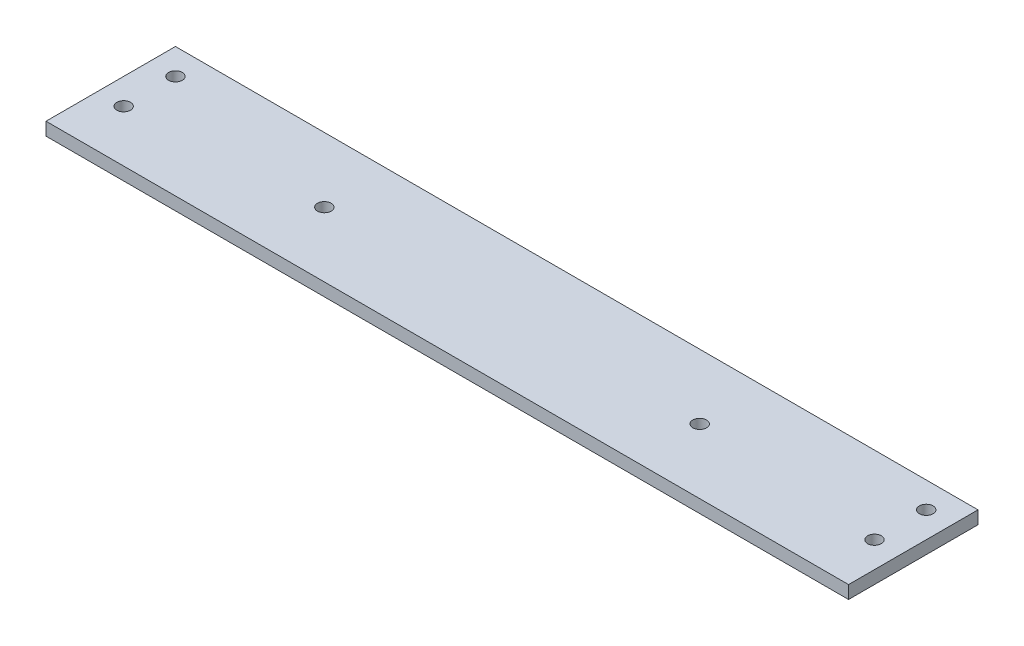
ISO-10303-21;
HEADER;
FILE_DESCRIPTION(('STEP AP214'),'2;1');
FILE_NAME('part.step','',(''),(''),'','','');
FILE_SCHEMA(('AUTOMOTIVE_DESIGN { 1 0 10303 214 1 1 1 1 }'));
ENDSEC;
DATA;
#1=APPLICATION_CONTEXT('core data for automotive mechanical design processes');
#2=APPLICATION_PROTOCOL_DEFINITION('international standard','automotive_design',2000,#1);
#3=PRODUCT_CONTEXT('',#1,'mechanical');
#4=PRODUCT('Part','Part','',(#3));
#5=PRODUCT_RELATED_PRODUCT_CATEGORY('part','',(#4));
#6=PRODUCT_DEFINITION_FORMATION('','',#4);
#7=PRODUCT_DEFINITION_CONTEXT('part definition',#1,'design');
#8=PRODUCT_DEFINITION('design','',#6,#7);
#9=PRODUCT_DEFINITION_SHAPE('','',#8);
#10=(LENGTH_UNIT() NAMED_UNIT(*) SI_UNIT(.MILLI.,.METRE.));
#11=(NAMED_UNIT(*) PLANE_ANGLE_UNIT() SI_UNIT($,.RADIAN.));
#12=(NAMED_UNIT(*) SI_UNIT($,.STERADIAN.) SOLID_ANGLE_UNIT());
#13=UNCERTAINTY_MEASURE_WITH_UNIT(LENGTH_MEASURE(1.E-05),#10,'distance_accuracy_value','');
#14=(GEOMETRIC_REPRESENTATION_CONTEXT(3) GLOBAL_UNCERTAINTY_ASSIGNED_CONTEXT((#13)) GLOBAL_UNIT_ASSIGNED_CONTEXT((#10,
#11,#12)) REPRESENTATION_CONTEXT('',''));
#15=CARTESIAN_POINT('',(0.,0.,0.));
#16=DIRECTION('',(0.,0.,1.));
#17=DIRECTION('',(1.,0.,0.));
#18=AXIS2_PLACEMENT_3D('',#15,#16,#17);
#19=CARTESIAN_POINT('',(196.85,6.35,31.75));
#20=DIRECTION('',(-1.,0.,0.));
#21=DIRECTION('',(0.,0.,1.));
#22=AXIS2_PLACEMENT_3D('',#19,#20,#21);
#23=PLANE('',#22);
#24=DIRECTION('',(0.,0.,-1.));
#25=VECTOR('',#24,1.);
#26=CARTESIAN_POINT('',(196.85,0.,31.75));
#27=LINE('',#26,#25);
#28=CARTESIAN_POINT('',(196.85,0.,31.75));
#29=VERTEX_POINT('',#28);
#30=CARTESIAN_POINT('',(196.85,0.,-31.75));
#31=VERTEX_POINT('',#30);
#32=EDGE_CURVE('E120',#29,#31,#27,.T.);
#33=ORIENTED_EDGE('',*,*,#32,.T.);
#34=DIRECTION('',(0.,-1.,0.));
#35=VECTOR('',#34,1.);
#36=CARTESIAN_POINT('',(196.85,6.35,-31.75));
#37=LINE('',#36,#35);
#38=CARTESIAN_POINT('',(196.85,6.35,-31.75));
#39=VERTEX_POINT('',#38);
#40=EDGE_CURVE('E11',#39,#31,#37,.T.);
#41=ORIENTED_EDGE('',*,*,#40,.F.);
#42=DIRECTION('',(0.,0.,-1.));
#43=VECTOR('',#42,1.);
#44=CARTESIAN_POINT('',(196.85,6.35,31.75));
#45=LINE('',#44,#43);
#46=CARTESIAN_POINT('',(196.85,6.35,31.75));
#47=VERTEX_POINT('',#46);
#48=EDGE_CURVE('E103',#47,#39,#45,.T.);
#49=ORIENTED_EDGE('',*,*,#48,.F.);
#50=DIRECTION('',(0.,-1.,0.));
#51=VECTOR('',#50,1.);
#52=CARTESIAN_POINT('',(196.85,6.35,31.75));
#53=LINE('',#52,#51);
#54=EDGE_CURVE('E116',#47,#29,#53,.T.);
#55=ORIENTED_EDGE('',*,*,#54,.T.);
#56=EDGE_LOOP('',(#33,#41,#49,#55));
#57=FACE_BOUND('',#56,.T.);
#58=ADVANCED_FACE('F51',(#57),#23,.F.);
#59=CARTESIAN_POINT('',(-196.85,6.35,-31.75));
#60=DIRECTION('',(0.,0.,1.));
#61=DIRECTION('',(1.,0.,0.));
#62=AXIS2_PLACEMENT_3D('',#59,#60,#61);
#63=PLANE('',#62);
#64=DIRECTION('',(-1.,0.,0.));
#65=VECTOR('',#64,1.);
#66=CARTESIAN_POINT('',(-196.85,0.,-31.75));
#67=LINE('',#66,#65);
#68=CARTESIAN_POINT('',(-196.85,0.,-31.75));
#69=VERTEX_POINT('',#68);
#70=EDGE_CURVE('E108',#31,#69,#67,.T.);
#71=ORIENTED_EDGE('',*,*,#70,.T.);
#72=DIRECTION('',(0.,-1.,0.));
#73=VECTOR('',#72,1.);
#74=CARTESIAN_POINT('',(-196.85,6.35,-31.75));
#75=LINE('',#74,#73);
#76=CARTESIAN_POINT('',(-196.85,6.35,-31.75));
#77=VERTEX_POINT('',#76);
#78=EDGE_CURVE('E60',#77,#69,#75,.T.);
#79=ORIENTED_EDGE('',*,*,#78,.F.);
#80=DIRECTION('',(-1.,0.,0.));
#81=VECTOR('',#80,1.);
#82=CARTESIAN_POINT('',(-196.85,6.35,-31.75));
#83=LINE('',#82,#81);
#84=EDGE_CURVE('E98',#39,#77,#83,.T.);
#85=ORIENTED_EDGE('',*,*,#84,.F.);
#86=ORIENTED_EDGE('',*,*,#40,.T.);
#87=EDGE_LOOP('',(#71,#79,#85,#86));
#88=FACE_BOUND('',#87,.T.);
#89=ADVANCED_FACE('F107',(#88),#63,.F.);
#90=CARTESIAN_POINT('',(-196.85,6.35,31.75));
#91=DIRECTION('',(1.,0.,0.));
#92=DIRECTION('',(0.,0.,-1.));
#93=AXIS2_PLACEMENT_3D('',#90,#91,#92);
#94=PLANE('',#93);
#95=DIRECTION('',(0.,0.,1.));
#96=VECTOR('',#95,1.);
#97=CARTESIAN_POINT('',(-196.85,0.,31.75));
#98=LINE('',#97,#96);
#99=CARTESIAN_POINT('',(-196.85,0.,31.75));
#100=VERTEX_POINT('',#99);
#101=EDGE_CURVE('E85',#69,#100,#98,.T.);
#102=ORIENTED_EDGE('',*,*,#101,.T.);
#103=DIRECTION('',(0.,-1.,0.));
#104=VECTOR('',#103,1.);
#105=CARTESIAN_POINT('',(-196.85,6.35,31.75));
#106=LINE('',#105,#104);
#107=CARTESIAN_POINT('',(-196.85,6.35,31.75));
#108=VERTEX_POINT('',#107);
#109=EDGE_CURVE('E110',#108,#100,#106,.T.);
#110=ORIENTED_EDGE('',*,*,#109,.F.);
#111=DIRECTION('',(0.,0.,1.));
#112=VECTOR('',#111,1.);
#113=CARTESIAN_POINT('',(-196.85,6.35,31.75));
#114=LINE('',#113,#112);
#115=EDGE_CURVE('E101',#77,#108,#114,.T.);
#116=ORIENTED_EDGE('',*,*,#115,.F.);
#117=ORIENTED_EDGE('',*,*,#78,.T.);
#118=EDGE_LOOP('',(#102,#110,#116,#117));
#119=FACE_BOUND('',#118,.T.);
#120=ADVANCED_FACE('F111',(#119),#94,.F.);
#121=CARTESIAN_POINT('',(-196.85,6.35,31.75));
#122=DIRECTION('',(0.,0.,-1.));
#123=DIRECTION('',(-1.,0.,0.));
#124=AXIS2_PLACEMENT_3D('',#121,#122,#123);
#125=PLANE('',#124);
#126=DIRECTION('',(1.,0.,0.));
#127=VECTOR('',#126,1.);
#128=CARTESIAN_POINT('',(-196.85,0.,31.75));
#129=LINE('',#128,#127);
#130=EDGE_CURVE('E91',#100,#29,#129,.T.);
#131=ORIENTED_EDGE('',*,*,#130,.T.);
#132=ORIENTED_EDGE('',*,*,#54,.F.);
#133=DIRECTION('',(1.,0.,0.));
#134=VECTOR('',#133,1.);
#135=CARTESIAN_POINT('',(-196.85,6.35,31.75));
#136=LINE('',#135,#134);
#137=EDGE_CURVE('E68',#108,#47,#136,.T.);
#138=ORIENTED_EDGE('',*,*,#137,.F.);
#139=ORIENTED_EDGE('',*,*,#109,.T.);
#140=EDGE_LOOP('',(#131,#132,#138,#139));
#141=FACE_BOUND('',#140,.T.);
#142=ADVANCED_FACE('F135',(#141),#125,.F.);
#143=CARTESIAN_POINT('',(0.,6.35,0.));
#144=DIRECTION('',(0.,-1.,0.));
#145=DIRECTION('',(0.,0.,-1.));
#146=AXIS2_PLACEMENT_3D('',#143,#144,#145);
#147=PLANE('',#146);
#148=CARTESIAN_POINT('',(-184.15,6.35,6.35));
#149=DIRECTION('',(0.,-1.,0.));
#150=DIRECTION('',(0.,0.,-1.));
#151=AXIS2_PLACEMENT_3D('',#148,#149,#150);
#152=CIRCLE('',#151,3.36549999999999);
#153=CARTESIAN_POINT('',(-184.15,6.35,2.98450000000001));
#154=VERTEX_POINT('',#153);
#155=EDGE_CURVE('E147',#154,#154,#152,.T.);
#156=ORIENTED_EDGE('',*,*,#155,.T.);
#157=EDGE_LOOP('',(#156));
#158=FACE_BOUND('',#157,.T.);
#159=CARTESIAN_POINT('',(-184.15,6.35,-19.05));
#160=DIRECTION('',(0.,-1.,0.));
#161=DIRECTION('',(0.,0.,-1.));
#162=AXIS2_PLACEMENT_3D('',#159,#160,#161);
#163=CIRCLE('',#162,3.36549999999999);
#164=CARTESIAN_POINT('',(-184.15,6.35,-22.4155));
#165=VERTEX_POINT('',#164);
#166=EDGE_CURVE('E172',#165,#165,#163,.T.);
#167=ORIENTED_EDGE('',*,*,#166,.T.);
#168=EDGE_LOOP('',(#167));
#169=FACE_BOUND('',#168,.T.);
#170=CARTESIAN_POINT('',(92.0750000000001,6.35,1.11022302462516E-13));
#171=DIRECTION('',(0.,-1.,0.));
#172=DIRECTION('',(0.,0.,-1.));
#173=AXIS2_PLACEMENT_3D('',#170,#171,#172);
#174=CIRCLE('',#173,3.36549999999999);
#175=CARTESIAN_POINT('',(92.0750000000001,6.35,-3.36549999999988));
#176=VERTEX_POINT('',#175);
#177=EDGE_CURVE('E164',#176,#176,#174,.T.);
#178=ORIENTED_EDGE('',*,*,#177,.T.);
#179=EDGE_LOOP('',(#178));
#180=FACE_BOUND('',#179,.T.);
#181=CARTESIAN_POINT('',(184.15,6.35,6.35));
#182=DIRECTION('',(0.,-1.,0.));
#183=DIRECTION('',(0.,0.,-1.));
#184=AXIS2_PLACEMENT_3D('',#181,#182,#183);
#185=CIRCLE('',#184,3.36549999999999);
#186=CARTESIAN_POINT('',(184.15,6.35,2.98450000000001));
#187=VERTEX_POINT('',#186);
#188=EDGE_CURVE('E155',#187,#187,#185,.T.);
#189=ORIENTED_EDGE('',*,*,#188,.T.);
#190=EDGE_LOOP('',(#189));
#191=FACE_BOUND('',#190,.T.);
#192=CARTESIAN_POINT('',(184.15,6.35,-19.05));
#193=DIRECTION('',(0.,-1.,0.));
#194=DIRECTION('',(0.,0.,-1.));
#195=AXIS2_PLACEMENT_3D('',#192,#193,#194);
#196=CIRCLE('',#195,3.36549999999999);
#197=CARTESIAN_POINT('',(184.15,6.35,-22.4155));
#198=VERTEX_POINT('',#197);
#199=EDGE_CURVE('E156',#198,#198,#196,.T.);
#200=ORIENTED_EDGE('',*,*,#199,.T.);
#201=EDGE_LOOP('',(#200));
#202=FACE_BOUND('',#201,.T.);
#203=CARTESIAN_POINT('',(-92.0622678288608,6.35,1.14491749414469E-13));
#204=DIRECTION('',(0.,-1.,0.));
#205=DIRECTION('',(0.,0.,-1.));
#206=AXIS2_PLACEMENT_3D('',#203,#204,#205);
#207=CIRCLE('',#206,3.36549999999999);
#208=CARTESIAN_POINT('',(-92.0622678288608,6.35,-3.36549999999988));
#209=VERTEX_POINT('',#208);
#210=EDGE_CURVE('E124',#209,#209,#207,.T.);
#211=ORIENTED_EDGE('',*,*,#210,.T.);
#212=EDGE_LOOP('',(#211));
#213=FACE_BOUND('',#212,.T.);
#214=ORIENTED_EDGE('',*,*,#48,.T.);
#215=ORIENTED_EDGE('',*,*,#84,.T.);
#216=ORIENTED_EDGE('',*,*,#115,.T.);
#217=ORIENTED_EDGE('',*,*,#137,.T.);
#218=EDGE_LOOP('',(#214,#215,#216,#217));
#219=FACE_BOUND('',#218,.T.);
#220=ADVANCED_FACE('F99',(#158,#169,#180,#191,#202,#213,#219),#147,.F.);
#221=CARTESIAN_POINT('',(0.,0.,0.));
#222=DIRECTION('',(0.,-1.,0.));
#223=DIRECTION('',(0.,0.,-1.));
#224=AXIS2_PLACEMENT_3D('',#221,#222,#223);
#225=PLANE('',#224);
#226=CARTESIAN_POINT('',(-184.15,0.,6.35));
#227=DIRECTION('',(0.,-1.,0.));
#228=DIRECTION('',(0.,0.,-1.));
#229=AXIS2_PLACEMENT_3D('',#226,#227,#228);
#230=CIRCLE('',#229,3.36549999999999);
#231=CARTESIAN_POINT('',(-184.15,0.,2.98450000000001));
#232=VERTEX_POINT('',#231);
#233=EDGE_CURVE('E176',#232,#232,#230,.T.);
#234=ORIENTED_EDGE('',*,*,#233,.F.);
#235=EDGE_LOOP('',(#234));
#236=FACE_BOUND('',#235,.T.);
#237=CARTESIAN_POINT('',(-184.15,0.,-19.05));
#238=DIRECTION('',(0.,-1.,0.));
#239=DIRECTION('',(0.,0.,-1.));
#240=AXIS2_PLACEMENT_3D('',#237,#238,#239);
#241=CIRCLE('',#240,3.36549999999999);
#242=CARTESIAN_POINT('',(-184.15,0.,-22.4155));
#243=VERTEX_POINT('',#242);
#244=EDGE_CURVE('E168',#243,#243,#241,.T.);
#245=ORIENTED_EDGE('',*,*,#244,.F.);
#246=EDGE_LOOP('',(#245));
#247=FACE_BOUND('',#246,.T.);
#248=CARTESIAN_POINT('',(92.0750000000001,0.,1.11022302462516E-13));
#249=DIRECTION('',(0.,-1.,0.));
#250=DIRECTION('',(0.,0.,-1.));
#251=AXIS2_PLACEMENT_3D('',#248,#249,#250);
#252=CIRCLE('',#251,3.36549999999999);
#253=CARTESIAN_POINT('',(92.0750000000001,0.,-3.36549999999988));
#254=VERTEX_POINT('',#253);
#255=EDGE_CURVE('E160',#254,#254,#252,.T.);
#256=ORIENTED_EDGE('',*,*,#255,.F.);
#257=EDGE_LOOP('',(#256));
#258=FACE_BOUND('',#257,.T.);
#259=CARTESIAN_POINT('',(184.15,0.,6.35));
#260=DIRECTION('',(0.,-1.,0.));
#261=DIRECTION('',(0.,0.,-1.));
#262=AXIS2_PLACEMENT_3D('',#259,#260,#261);
#263=CIRCLE('',#262,3.36549999999999);
#264=CARTESIAN_POINT('',(184.15,0.,2.98450000000001));
#265=VERTEX_POINT('',#264);
#266=EDGE_CURVE('E151',#265,#265,#263,.T.);
#267=ORIENTED_EDGE('',*,*,#266,.F.);
#268=EDGE_LOOP('',(#267));
#269=FACE_BOUND('',#268,.T.);
#270=CARTESIAN_POINT('',(184.15,0.,-19.05));
#271=DIRECTION('',(0.,-1.,0.));
#272=DIRECTION('',(0.,0.,-1.));
#273=AXIS2_PLACEMENT_3D('',#270,#271,#272);
#274=CIRCLE('',#273,3.36549999999999);
#275=CARTESIAN_POINT('',(184.15,0.,-22.4155));
#276=VERTEX_POINT('',#275);
#277=EDGE_CURVE('E183',#276,#276,#274,.T.);
#278=ORIENTED_EDGE('',*,*,#277,.F.);
#279=EDGE_LOOP('',(#278));
#280=FACE_BOUND('',#279,.T.);
#281=CARTESIAN_POINT('',(-92.0622678288608,0.,1.14491749414469E-13));
#282=DIRECTION('',(0.,-1.,0.));
#283=DIRECTION('',(0.,0.,-1.));
#284=AXIS2_PLACEMENT_3D('',#281,#282,#283);
#285=CIRCLE('',#284,3.36549999999999);
#286=CARTESIAN_POINT('',(-92.0622678288608,0.,-3.36549999999988));
#287=VERTEX_POINT('',#286);
#288=EDGE_CURVE('E143',#287,#287,#285,.T.);
#289=ORIENTED_EDGE('',*,*,#288,.F.);
#290=EDGE_LOOP('',(#289));
#291=FACE_BOUND('',#290,.T.);
#292=ORIENTED_EDGE('',*,*,#32,.F.);
#293=ORIENTED_EDGE('',*,*,#130,.F.);
#294=ORIENTED_EDGE('',*,*,#101,.F.);
#295=ORIENTED_EDGE('',*,*,#70,.F.);
#296=EDGE_LOOP('',(#292,#293,#294,#295));
#297=FACE_BOUND('',#296,.T.);
#298=ADVANCED_FACE('F138',(#236,#247,#258,#269,#280,#291,#297),#225,.T.);
#299=CARTESIAN_POINT('',(-92.0622678288608,6.35,1.14491749414469E-13));
#300=DIRECTION('',(0.,-1.,0.));
#301=DIRECTION('',(0.,0.,-1.));
#302=AXIS2_PLACEMENT_3D('',#299,#300,#301);
#303=CYLINDRICAL_SURFACE('',#302,3.36549999999999);
#304=ORIENTED_EDGE('',*,*,#210,.F.);
#305=EDGE_LOOP('',(#304));
#306=FACE_BOUND('',#305,.T.);
#307=ORIENTED_EDGE('',*,*,#288,.T.);
#308=EDGE_LOOP('',(#307));
#309=FACE_BOUND('',#308,.T.);
#310=ADVANCED_FACE('F198',(#306,#309),#303,.F.);
#311=CARTESIAN_POINT('',(184.15,6.35,-19.05));
#312=DIRECTION('',(0.,-1.,0.));
#313=DIRECTION('',(0.,0.,-1.));
#314=AXIS2_PLACEMENT_3D('',#311,#312,#313);
#315=CYLINDRICAL_SURFACE('',#314,3.36549999999999);
#316=ORIENTED_EDGE('',*,*,#199,.F.);
#317=EDGE_LOOP('',(#316));
#318=FACE_BOUND('',#317,.T.);
#319=ORIENTED_EDGE('',*,*,#277,.T.);
#320=EDGE_LOOP('',(#319));
#321=FACE_BOUND('',#320,.T.);
#322=ADVANCED_FACE('F194',(#318,#321),#315,.F.);
#323=CARTESIAN_POINT('',(184.15,6.35,6.35));
#324=DIRECTION('',(0.,-1.,0.));
#325=DIRECTION('',(0.,0.,-1.));
#326=AXIS2_PLACEMENT_3D('',#323,#324,#325);
#327=CYLINDRICAL_SURFACE('',#326,3.36549999999999);
#328=ORIENTED_EDGE('',*,*,#188,.F.);
#329=EDGE_LOOP('',(#328));
#330=FACE_BOUND('',#329,.T.);
#331=ORIENTED_EDGE('',*,*,#266,.T.);
#332=EDGE_LOOP('',(#331));
#333=FACE_BOUND('',#332,.T.);
#334=ADVANCED_FACE('F197',(#330,#333),#327,.F.);
#335=CARTESIAN_POINT('',(92.0750000000001,6.35,1.11022302462516E-13));
#336=DIRECTION('',(0.,-1.,0.));
#337=DIRECTION('',(0.,0.,-1.));
#338=AXIS2_PLACEMENT_3D('',#335,#336,#337);
#339=CYLINDRICAL_SURFACE('',#338,3.36549999999999);
#340=ORIENTED_EDGE('',*,*,#177,.F.);
#341=EDGE_LOOP('',(#340));
#342=FACE_BOUND('',#341,.T.);
#343=ORIENTED_EDGE('',*,*,#255,.T.);
#344=EDGE_LOOP('',(#343));
#345=FACE_BOUND('',#344,.T.);
#346=ADVANCED_FACE('F240',(#342,#345),#339,.F.);
#347=CARTESIAN_POINT('',(-184.15,6.35,-19.05));
#348=DIRECTION('',(0.,-1.,0.));
#349=DIRECTION('',(0.,0.,-1.));
#350=AXIS2_PLACEMENT_3D('',#347,#348,#349);
#351=CYLINDRICAL_SURFACE('',#350,3.36549999999999);
#352=ORIENTED_EDGE('',*,*,#166,.F.);
#353=EDGE_LOOP('',(#352));
#354=FACE_BOUND('',#353,.T.);
#355=ORIENTED_EDGE('',*,*,#244,.T.);
#356=EDGE_LOOP('',(#355));
#357=FACE_BOUND('',#356,.T.);
#358=ADVANCED_FACE('F246',(#354,#357),#351,.F.);
#359=CARTESIAN_POINT('',(-184.15,6.35,6.35));
#360=DIRECTION('',(0.,-1.,0.));
#361=DIRECTION('',(0.,0.,-1.));
#362=AXIS2_PLACEMENT_3D('',#359,#360,#361);
#363=CYLINDRICAL_SURFACE('',#362,3.36549999999999);
#364=ORIENTED_EDGE('',*,*,#155,.F.);
#365=EDGE_LOOP('',(#364));
#366=FACE_BOUND('',#365,.T.);
#367=ORIENTED_EDGE('',*,*,#233,.T.);
#368=EDGE_LOOP('',(#367));
#369=FACE_BOUND('',#368,.T.);
#370=ADVANCED_FACE('F252',(#366,#369),#363,.F.);
#371=CLOSED_SHELL('',(#58,#89,#120,#142,#220,#298,#310,#322,#334,#346,#358,#370));
#372=MANIFOLD_SOLID_BREP('B2',#371);
#373=ADVANCED_BREP_SHAPE_REPRESENTATION('',(#18,#372),#14);
#374=SHAPE_DEFINITION_REPRESENTATION(#9,#373);
ENDSEC;
END-ISO-10303-21;
